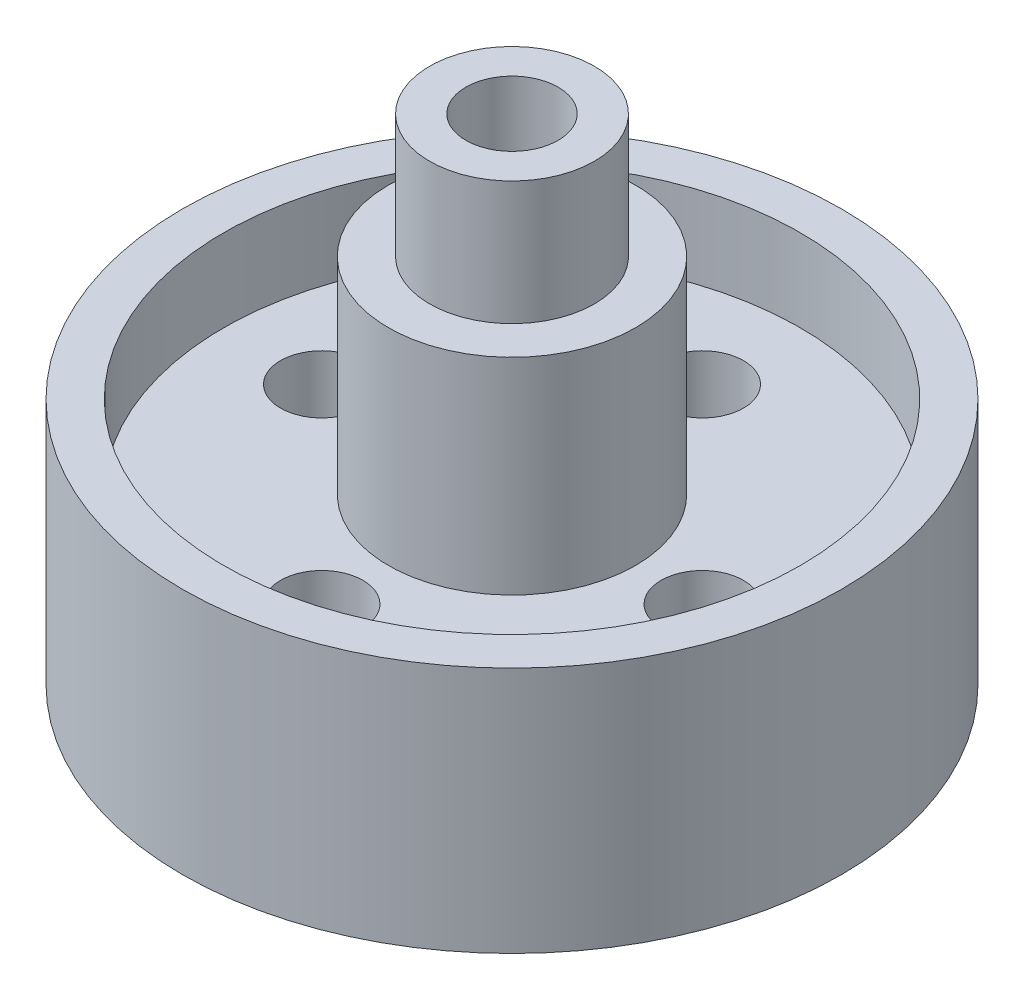
ISO-10303-21;
HEADER;
FILE_DESCRIPTION(('STEP AP214'),'2;1');
FILE_NAME('part.step','',(''),(''),'','','');
FILE_SCHEMA(('AUTOMOTIVE_DESIGN { 1 0 10303 214 1 1 1 1 }'));
ENDSEC;
DATA;
#1=APPLICATION_CONTEXT('core data for automotive mechanical design processes');
#2=APPLICATION_PROTOCOL_DEFINITION('international standard','automotive_design',2000,#1);
#3=PRODUCT_CONTEXT('',#1,'mechanical');
#4=PRODUCT('Part','Part','',(#3));
#5=PRODUCT_RELATED_PRODUCT_CATEGORY('part','',(#4));
#6=PRODUCT_DEFINITION_FORMATION('','',#4);
#7=PRODUCT_DEFINITION_CONTEXT('part definition',#1,'design');
#8=PRODUCT_DEFINITION('design','',#6,#7);
#9=PRODUCT_DEFINITION_SHAPE('','',#8);
#10=(LENGTH_UNIT() NAMED_UNIT(*) SI_UNIT(.MILLI.,.METRE.));
#11=(NAMED_UNIT(*) PLANE_ANGLE_UNIT() SI_UNIT($,.RADIAN.));
#12=(NAMED_UNIT(*) SI_UNIT($,.STERADIAN.) SOLID_ANGLE_UNIT());
#13=UNCERTAINTY_MEASURE_WITH_UNIT(LENGTH_MEASURE(1.E-05),#10,'distance_accuracy_value','');
#14=(GEOMETRIC_REPRESENTATION_CONTEXT(3) GLOBAL_UNCERTAINTY_ASSIGNED_CONTEXT((#13)) GLOBAL_UNIT_ASSIGNED_CONTEXT((#10,
#11,#12)) REPRESENTATION_CONTEXT('',''));
#15=CARTESIAN_POINT('',(0.,0.,0.));
#16=DIRECTION('',(0.,0.,1.));
#17=DIRECTION('',(1.,0.,0.));
#18=AXIS2_PLACEMENT_3D('',#15,#16,#17);
#19=CARTESIAN_POINT('',(750.,2250.,0.));
#20=DIRECTION('',(0.,1.,0.));
#21=DIRECTION('',(-1.,0.,0.));
#22=AXIS2_PLACEMENT_3D('',#19,#20,#21);
#23=PLANE('',#22);
#24=CARTESIAN_POINT('',(-2.15183835212207E-13,2250.,0.));
#25=DIRECTION('',(0.,-1.,0.));
#26=DIRECTION('',(1.,0.,0.));
#27=AXIS2_PLACEMENT_3D('',#24,#25,#26);
#28=CIRCLE('',#27,500.);
#29=CARTESIAN_POINT('',(500.,2250.,0.));
#30=VERTEX_POINT('',#29);
#31=EDGE_CURVE('E72',#30,#30,#28,.T.);
#32=ORIENTED_EDGE('',*,*,#31,.T.);
#33=EDGE_LOOP('',(#32));
#34=FACE_BOUND('',#33,.T.);
#35=CARTESIAN_POINT('',(-2.15183835212207E-13,2250.,0.));
#36=DIRECTION('',(0.,-1.,0.));
#37=DIRECTION('',(1.,0.,0.));
#38=AXIS2_PLACEMENT_3D('',#35,#36,#37);
#39=CIRCLE('',#38,750.);
#40=CARTESIAN_POINT('',(750.,2250.,0.));
#41=VERTEX_POINT('',#40);
#42=EDGE_CURVE('E10',#41,#41,#39,.T.);
#43=ORIENTED_EDGE('',*,*,#42,.F.);
#44=EDGE_LOOP('',(#43));
#45=FACE_BOUND('',#44,.T.);
#46=ADVANCED_FACE('F37',(#34,#45),#23,.T.);
#47=CARTESIAN_POINT('',(0.,0.,0.));
#48=DIRECTION('',(0.,-1.,0.));
#49=DIRECTION('',(1.,0.,0.));
#50=AXIS2_PLACEMENT_3D('',#47,#48,#49);
#51=CYLINDRICAL_SURFACE('',#50,750.);
#52=CARTESIAN_POINT('',(0.,1000.,0.));
#53=DIRECTION('',(0.,-1.,0.));
#54=DIRECTION('',(1.,0.,0.));
#55=AXIS2_PLACEMENT_3D('',#52,#53,#54);
#56=CIRCLE('',#55,750.);
#57=CARTESIAN_POINT('',(750.,1000.,0.));
#58=VERTEX_POINT('',#57);
#59=EDGE_CURVE('E44',#58,#58,#56,.T.);
#60=ORIENTED_EDGE('',*,*,#59,.F.);
#61=EDGE_LOOP('',(#60));
#62=FACE_BOUND('',#61,.T.);
#63=ORIENTED_EDGE('',*,*,#42,.T.);
#64=EDGE_LOOP('',(#63));
#65=FACE_BOUND('',#64,.T.);
#66=ADVANCED_FACE('F131',(#62,#65),#51,.T.);
#67=CARTESIAN_POINT('',(1750.,1000.,0.));
#68=DIRECTION('',(0.,1.,0.));
#69=DIRECTION('',(-1.,0.,0.));
#70=AXIS2_PLACEMENT_3D('',#67,#68,#69);
#71=PLANE('',#70);
#72=CARTESIAN_POINT('',(-4.12829820645813E-12,1000.,1155.));
#73=DIRECTION('',(0.,1.,0.));
#74=DIRECTION('',(0.,0.,-1.));
#75=AXIS2_PLACEMENT_3D('',#72,#73,#74);
#76=CIRCLE('',#75,250.);
#77=CARTESIAN_POINT('',(-3.25542787174735E-12,1000.,905.));
#78=VERTEX_POINT('',#77);
#79=EDGE_CURVE('E109',#78,#78,#76,.T.);
#80=ORIENTED_EDGE('',*,*,#79,.F.);
#81=EDGE_LOOP('',(#80));
#82=FACE_BOUND('',#81,.T.);
#83=CARTESIAN_POINT('',(-1155.,1000.,0.));
#84=DIRECTION('',(0.,1.,0.));
#85=DIRECTION('',(1.,0.,0.));
#86=AXIS2_PLACEMENT_3D('',#83,#84,#85);
#87=CIRCLE('',#86,250.);
#88=CARTESIAN_POINT('',(-905.,1000.,0.));
#89=VERTEX_POINT('',#88);
#90=EDGE_CURVE('E101',#89,#89,#87,.T.);
#91=ORIENTED_EDGE('',*,*,#90,.F.);
#92=EDGE_LOOP('',(#91));
#93=FACE_BOUND('',#92,.T.);
#94=CARTESIAN_POINT('',(1.20023455789971E-11,1000.,-1155.));
#95=DIRECTION('',(0.,1.,0.));
#96=DIRECTION('',(0.,0.,1.));
#97=AXIS2_PLACEMENT_3D('',#94,#95,#96);
#98=CIRCLE('',#97,250.);
#99=CARTESIAN_POINT('',(9.38373457486479E-12,1000.,-905.));
#100=VERTEX_POINT('',#99);
#101=EDGE_CURVE('E93',#100,#100,#98,.T.);
#102=ORIENTED_EDGE('',*,*,#101,.F.);
#103=EDGE_LOOP('',(#102));
#104=FACE_BOUND('',#103,.T.);
#105=CARTESIAN_POINT('',(1155.,1000.,0.));
#106=DIRECTION('',(0.,1.,0.));
#107=DIRECTION('',(-1.,0.,0.));
#108=AXIS2_PLACEMENT_3D('',#105,#106,#107);
#109=CIRCLE('',#108,250.);
#110=CARTESIAN_POINT('',(905.,1000.,0.));
#111=VERTEX_POINT('',#110);
#112=EDGE_CURVE('E85',#111,#111,#109,.T.);
#113=ORIENTED_EDGE('',*,*,#112,.F.);
#114=EDGE_LOOP('',(#113));
#115=FACE_BOUND('',#114,.T.);
#116=ORIENTED_EDGE('',*,*,#59,.T.);
#117=EDGE_LOOP('',(#116));
#118=FACE_BOUND('',#117,.T.);
#119=CARTESIAN_POINT('',(0.,1000.,0.));
#120=DIRECTION('',(0.,-1.,0.));
#121=DIRECTION('',(1.,0.,0.));
#122=AXIS2_PLACEMENT_3D('',#119,#120,#121);
#123=CIRCLE('',#122,1750.);
#124=CARTESIAN_POINT('',(1750.,1000.,0.));
#125=VERTEX_POINT('',#124);
#126=EDGE_CURVE('E49',#125,#125,#123,.T.);
#127=ORIENTED_EDGE('',*,*,#126,.F.);
#128=EDGE_LOOP('',(#127));
#129=FACE_BOUND('',#128,.T.);
#130=ADVANCED_FACE('F127',(#82,#93,#104,#115,#118,#129),#71,.T.);
#131=CARTESIAN_POINT('',(0.,0.,0.));
#132=DIRECTION('',(0.,-1.,0.));
#133=DIRECTION('',(1.,0.,0.));
#134=AXIS2_PLACEMENT_3D('',#131,#132,#133);
#135=CYLINDRICAL_SURFACE('',#134,1750.);
#136=ORIENTED_EDGE('',*,*,#126,.T.);
#137=EDGE_LOOP('',(#136));
#138=FACE_BOUND('',#137,.T.);
#139=CARTESIAN_POINT('',(-1.43455890141472E-13,1500.,0.));
#140=DIRECTION('',(0.,-1.,0.));
#141=DIRECTION('',(1.,0.,0.));
#142=AXIS2_PLACEMENT_3D('',#139,#140,#141);
#143=CIRCLE('',#142,1750.);
#144=CARTESIAN_POINT('',(1750.,1500.,0.));
#145=VERTEX_POINT('',#144);
#146=EDGE_CURVE('E54',#145,#145,#143,.T.);
#147=ORIENTED_EDGE('',*,*,#146,.F.);
#148=EDGE_LOOP('',(#147));
#149=FACE_BOUND('',#148,.T.);
#150=ADVANCED_FACE('F130',(#138,#149),#135,.F.);
#151=CARTESIAN_POINT('',(2000.,1500.,0.));
#152=DIRECTION('',(0.,1.,0.));
#153=DIRECTION('',(-1.,0.,0.));
#154=AXIS2_PLACEMENT_3D('',#151,#152,#153);
#155=PLANE('',#154);
#156=ORIENTED_EDGE('',*,*,#146,.T.);
#157=EDGE_LOOP('',(#156));
#158=FACE_BOUND('',#157,.T.);
#159=CARTESIAN_POINT('',(-1.43455890141472E-13,1500.,0.));
#160=DIRECTION('',(0.,-1.,0.));
#161=DIRECTION('',(1.,0.,0.));
#162=AXIS2_PLACEMENT_3D('',#159,#160,#161);
#163=CIRCLE('',#162,2000.);
#164=CARTESIAN_POINT('',(2000.,1500.,0.));
#165=VERTEX_POINT('',#164);
#166=EDGE_CURVE('E60',#165,#165,#163,.T.);
#167=ORIENTED_EDGE('',*,*,#166,.F.);
#168=EDGE_LOOP('',(#167));
#169=FACE_BOUND('',#168,.T.);
#170=ADVANCED_FACE('F143',(#158,#169),#155,.T.);
#171=CARTESIAN_POINT('',(0.,0.,0.));
#172=DIRECTION('',(0.,-1.,0.));
#173=DIRECTION('',(1.,0.,0.));
#174=AXIS2_PLACEMENT_3D('',#171,#172,#173);
#175=CYLINDRICAL_SURFACE('',#174,2000.);
#176=ORIENTED_EDGE('',*,*,#166,.T.);
#177=EDGE_LOOP('',(#176));
#178=FACE_BOUND('',#177,.T.);
#179=CARTESIAN_POINT('',(0.,-1.91274520188629E-13,0.));
#180=DIRECTION('',(0.,-1.,0.));
#181=DIRECTION('',(1.,0.,0.));
#182=AXIS2_PLACEMENT_3D('',#179,#180,#181);
#183=CIRCLE('',#182,2000.);
#184=CARTESIAN_POINT('',(2000.,0.,0.));
#185=VERTEX_POINT('',#184);
#186=EDGE_CURVE('E64',#185,#185,#183,.T.);
#187=ORIENTED_EDGE('',*,*,#186,.F.);
#188=EDGE_LOOP('',(#187));
#189=FACE_BOUND('',#188,.T.);
#190=ADVANCED_FACE('F149',(#178,#189),#175,.T.);
#191=CARTESIAN_POINT('',(0.,0.,0.));
#192=DIRECTION('',(0.,-1.,0.));
#193=DIRECTION('',(1.,0.,0.));
#194=AXIS2_PLACEMENT_3D('',#191,#192,#193);
#195=PLANE('',#194);
#196=CARTESIAN_POINT('',(-4.03266094636382E-12,-2.22044604925031E-13,1155.));
#197=DIRECTION('',(0.,1.,0.));
#198=DIRECTION('',(0.,0.,-1.));
#199=AXIS2_PLACEMENT_3D('',#196,#197,#198);
#200=CIRCLE('',#199,250.);
#201=CARTESIAN_POINT('',(-3.15979061165304E-12,-2.22044604925031E-13,905.));
#202=VERTEX_POINT('',#201);
#203=EDGE_CURVE('E89',#202,#202,#200,.T.);
#204=ORIENTED_EDGE('',*,*,#203,.T.);
#205=EDGE_LOOP('',(#204));
#206=FACE_BOUND('',#205,.T.);
#207=CARTESIAN_POINT('',(-1155.,-3.33066907387547E-13,0.));
#208=DIRECTION('',(0.,1.,0.));
#209=DIRECTION('',(1.,0.,0.));
#210=AXIS2_PLACEMENT_3D('',#207,#208,#209);
#211=CIRCLE('',#210,250.);
#212=CARTESIAN_POINT('',(-905.,-3.09157592363968E-13,0.));
#213=VERTEX_POINT('',#212);
#214=EDGE_CURVE('E105',#213,#213,#211,.T.);
#215=ORIENTED_EDGE('',*,*,#214,.T.);
#216=EDGE_LOOP('',(#215));
#217=FACE_BOUND('',#216,.T.);
#218=CARTESIAN_POINT('',(1.20979828390915E-11,-2.22044604925031E-13,-1155.));
#219=DIRECTION('',(0.,1.,0.));
#220=DIRECTION('',(0.,0.,1.));
#221=AXIS2_PLACEMENT_3D('',#218,#219,#220);
#222=CIRCLE('',#221,250.);
#223=CARTESIAN_POINT('',(9.47937183495911E-12,-2.22044604925032E-13,-905.));
#224=VERTEX_POINT('',#223);
#225=EDGE_CURVE('E97',#224,#224,#222,.T.);
#226=ORIENTED_EDGE('',*,*,#225,.T.);
#227=EDGE_LOOP('',(#226));
#228=FACE_BOUND('',#227,.T.);
#229=CARTESIAN_POINT('',(1155.,-1.11022302462516E-13,0.));
#230=DIRECTION('',(0.,1.,0.));
#231=DIRECTION('',(-1.,0.,0.));
#232=AXIS2_PLACEMENT_3D('',#229,#230,#231);
#233=CIRCLE('',#232,250.);
#234=CARTESIAN_POINT('',(905.,-1.34931617486094E-13,0.));
#235=VERTEX_POINT('',#234);
#236=EDGE_CURVE('E81',#235,#235,#233,.T.);
#237=ORIENTED_EDGE('',*,*,#236,.T.);
#238=EDGE_LOOP('',(#237));
#239=FACE_BOUND('',#238,.T.);
#240=CARTESIAN_POINT('',(0.,0.,0.));
#241=DIRECTION('',(0.,1.,0.));
#242=DIRECTION('',(-1.,0.,0.));
#243=AXIS2_PLACEMENT_3D('',#240,#241,#242);
#244=CIRCLE('',#243,280.);
#245=CARTESIAN_POINT('',(-280.,0.,0.));
#246=VERTEX_POINT('',#245);
#247=EDGE_CURVE('E76',#246,#246,#244,.T.);
#248=ORIENTED_EDGE('',*,*,#247,.T.);
#249=EDGE_LOOP('',(#248));
#250=FACE_BOUND('',#249,.T.);
#251=ORIENTED_EDGE('',*,*,#186,.T.);
#252=EDGE_LOOP('',(#251));
#253=FACE_BOUND('',#252,.T.);
#254=ADVANCED_FACE('F117',(#206,#217,#228,#239,#250,#253),#195,.T.);
#255=CARTESIAN_POINT('',(500.,3000.,0.));
#256=DIRECTION('',(0.,1.,0.));
#257=DIRECTION('',(-1.,0.,0.));
#258=AXIS2_PLACEMENT_3D('',#255,#256,#257);
#259=PLANE('',#258);
#260=CARTESIAN_POINT('',(-2.86911780282943E-13,3000.,0.));
#261=DIRECTION('',(0.,1.,0.));
#262=DIRECTION('',(-1.,0.,0.));
#263=AXIS2_PLACEMENT_3D('',#260,#261,#262);
#264=CIRCLE('',#263,280.);
#265=CARTESIAN_POINT('',(-280.,3000.,0.));
#266=VERTEX_POINT('',#265);
#267=EDGE_CURVE('E77',#266,#266,#264,.T.);
#268=ORIENTED_EDGE('',*,*,#267,.F.);
#269=EDGE_LOOP('',(#268));
#270=FACE_BOUND('',#269,.T.);
#271=CARTESIAN_POINT('',(-2.86911780282943E-13,3000.,0.));
#272=DIRECTION('',(0.,-1.,0.));
#273=DIRECTION('',(1.,0.,0.));
#274=AXIS2_PLACEMENT_3D('',#271,#272,#273);
#275=CIRCLE('',#274,500.);
#276=CARTESIAN_POINT('',(500.,3000.,0.));
#277=VERTEX_POINT('',#276);
#278=EDGE_CURVE('E68',#277,#277,#275,.T.);
#279=ORIENTED_EDGE('',*,*,#278,.F.);
#280=EDGE_LOOP('',(#279));
#281=FACE_BOUND('',#280,.T.);
#282=ADVANCED_FACE('F159',(#270,#281),#259,.T.);
#283=CARTESIAN_POINT('',(0.,0.,0.));
#284=DIRECTION('',(0.,-1.,0.));
#285=DIRECTION('',(1.,0.,0.));
#286=AXIS2_PLACEMENT_3D('',#283,#284,#285);
#287=CYLINDRICAL_SURFACE('',#286,500.);
#288=ORIENTED_EDGE('',*,*,#278,.T.);
#289=EDGE_LOOP('',(#288));
#290=FACE_BOUND('',#289,.T.);
#291=ORIENTED_EDGE('',*,*,#31,.F.);
#292=EDGE_LOOP('',(#291));
#293=FACE_BOUND('',#292,.T.);
#294=ADVANCED_FACE('F164',(#290,#293),#287,.T.);
#295=CARTESIAN_POINT('',(0.,0.,0.));
#296=DIRECTION('',(0.,1.,0.));
#297=DIRECTION('',(-1.,0.,0.));
#298=AXIS2_PLACEMENT_3D('',#295,#296,#297);
#299=CYLINDRICAL_SURFACE('',#298,280.);
#300=ORIENTED_EDGE('',*,*,#247,.F.);
#301=EDGE_LOOP('',(#300));
#302=FACE_BOUND('',#301,.T.);
#303=ORIENTED_EDGE('',*,*,#267,.T.);
#304=EDGE_LOOP('',(#303));
#305=FACE_BOUND('',#304,.T.);
#306=ADVANCED_FACE('F177',(#302,#305),#299,.F.);
#307=CARTESIAN_POINT('',(1155.,-1.11022302462516E-13,0.));
#308=DIRECTION('',(0.,1.,0.));
#309=DIRECTION('',(-1.,0.,0.));
#310=AXIS2_PLACEMENT_3D('',#307,#308,#309);
#311=CYLINDRICAL_SURFACE('',#310,250.);
#312=ORIENTED_EDGE('',*,*,#236,.F.);
#313=EDGE_LOOP('',(#312));
#314=FACE_BOUND('',#313,.T.);
#315=ORIENTED_EDGE('',*,*,#112,.T.);
#316=EDGE_LOOP('',(#315));
#317=FACE_BOUND('',#316,.T.);
#318=ADVANCED_FACE('F183',(#314,#317),#311,.F.);
#319=CARTESIAN_POINT('',(1.20979828390915E-11,-2.22044604925031E-13,-1155.));
#320=DIRECTION('',(0.,1.,0.));
#321=DIRECTION('',(-1.,0.,0.));
#322=AXIS2_PLACEMENT_3D('',#319,#320,#321);
#323=CYLINDRICAL_SURFACE('',#322,250.);
#324=ORIENTED_EDGE('',*,*,#225,.F.);
#325=EDGE_LOOP('',(#324));
#326=FACE_BOUND('',#325,.T.);
#327=ORIENTED_EDGE('',*,*,#101,.T.);
#328=EDGE_LOOP('',(#327));
#329=FACE_BOUND('',#328,.T.);
#330=ADVANCED_FACE('F189',(#326,#329),#323,.F.);
#331=CARTESIAN_POINT('',(-1155.,-3.33066907387547E-13,0.));
#332=DIRECTION('',(0.,1.,0.));
#333=DIRECTION('',(-1.,0.,0.));
#334=AXIS2_PLACEMENT_3D('',#331,#332,#333);
#335=CYLINDRICAL_SURFACE('',#334,250.);
#336=ORIENTED_EDGE('',*,*,#214,.F.);
#337=EDGE_LOOP('',(#336));
#338=FACE_BOUND('',#337,.T.);
#339=ORIENTED_EDGE('',*,*,#90,.T.);
#340=EDGE_LOOP('',(#339));
#341=FACE_BOUND('',#340,.T.);
#342=ADVANCED_FACE('F123',(#338,#341),#335,.F.);
#343=CARTESIAN_POINT('',(-4.03266094636382E-12,-2.22044604925031E-13,1155.));
#344=DIRECTION('',(0.,1.,0.));
#345=DIRECTION('',(-1.,0.,0.));
#346=AXIS2_PLACEMENT_3D('',#343,#344,#345);
#347=CYLINDRICAL_SURFACE('',#346,250.);
#348=ORIENTED_EDGE('',*,*,#203,.F.);
#349=EDGE_LOOP('',(#348));
#350=FACE_BOUND('',#349,.T.);
#351=ORIENTED_EDGE('',*,*,#79,.T.);
#352=EDGE_LOOP('',(#351));
#353=FACE_BOUND('',#352,.T.);
#354=ADVANCED_FACE('F120',(#350,#353),#347,.F.);
#355=CLOSED_SHELL('',(#46,#66,#130,#150,#170,#190,#254,#282,#294,#306,#318,#330,#342,#354));
#356=MANIFOLD_SOLID_BREP('B2',#355);
#357=ADVANCED_BREP_SHAPE_REPRESENTATION('',(#18,#356),#14);
#358=SHAPE_DEFINITION_REPRESENTATION(#9,#357);
ENDSEC;
END-ISO-10303-21;
